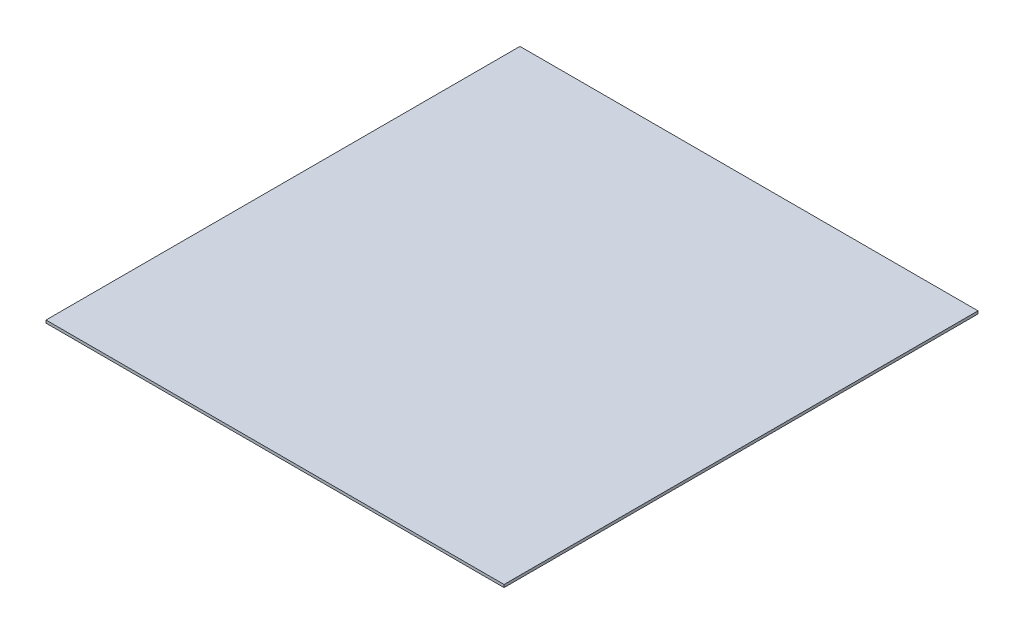
ISO-10303-21;
HEADER;
FILE_DESCRIPTION(('STEP AP214'),'2;1');
FILE_NAME('part.step','',(''),(''),'','','');
FILE_SCHEMA(('AUTOMOTIVE_DESIGN { 1 0 10303 214 1 1 1 1 }'));
ENDSEC;
DATA;
#1=APPLICATION_CONTEXT('core data for automotive mechanical design processes');
#2=APPLICATION_PROTOCOL_DEFINITION('international standard','automotive_design',2000,#1);
#3=PRODUCT_CONTEXT('',#1,'mechanical');
#4=PRODUCT('Part','Part','',(#3));
#5=PRODUCT_RELATED_PRODUCT_CATEGORY('part','',(#4));
#6=PRODUCT_DEFINITION_FORMATION('','',#4);
#7=PRODUCT_DEFINITION_CONTEXT('part definition',#1,'design');
#8=PRODUCT_DEFINITION('design','',#6,#7);
#9=PRODUCT_DEFINITION_SHAPE('','',#8);
#10=(LENGTH_UNIT() NAMED_UNIT(*) SI_UNIT(.MILLI.,.METRE.));
#11=(NAMED_UNIT(*) PLANE_ANGLE_UNIT() SI_UNIT($,.RADIAN.));
#12=(NAMED_UNIT(*) SI_UNIT($,.STERADIAN.) SOLID_ANGLE_UNIT());
#13=UNCERTAINTY_MEASURE_WITH_UNIT(LENGTH_MEASURE(1.E-05),#10,'distance_accuracy_value','');
#14=(GEOMETRIC_REPRESENTATION_CONTEXT(3) GLOBAL_UNCERTAINTY_ASSIGNED_CONTEXT((#13)) GLOBAL_UNIT_ASSIGNED_CONTEXT((#10,
#11,#12)) REPRESENTATION_CONTEXT('',''));
#15=CARTESIAN_POINT('',(0.,0.,0.));
#16=DIRECTION('',(0.,0.,1.));
#17=DIRECTION('',(1.,0.,0.));
#18=AXIS2_PLACEMENT_3D('',#15,#16,#17);
#19=CARTESIAN_POINT('',(0.,9.,0.));
#20=DIRECTION('',(1.,0.,0.));
#21=DIRECTION('',(0.,0.,-1.));
#22=AXIS2_PLACEMENT_3D('',#19,#20,#21);
#23=PLANE('',#22);
#24=DIRECTION('',(0.,0.,1.));
#25=VECTOR('',#24,1.);
#26=CARTESIAN_POINT('',(0.,0.,0.));
#27=LINE('',#26,#25);
#28=CARTESIAN_POINT('',(0.,0.,0.));
#29=VERTEX_POINT('',#28);
#30=CARTESIAN_POINT('',(1.90065183227669E-13,0.,1552.));
#31=VERTEX_POINT('',#30);
#32=EDGE_CURVE('E113',#29,#31,#27,.T.);
#33=ORIENTED_EDGE('',*,*,#32,.T.);
#34=DIRECTION('',(0.,-1.,0.));
#35=VECTOR('',#34,1.);
#36=CARTESIAN_POINT('',(1.90065183227669E-13,9.,1552.));
#37=LINE('',#36,#35);
#38=CARTESIAN_POINT('',(1.90065183227669E-13,9.,1552.));
#39=VERTEX_POINT('',#38);
#40=EDGE_CURVE('E11',#39,#31,#37,.T.);
#41=ORIENTED_EDGE('',*,*,#40,.F.);
#42=DIRECTION('',(0.,0.,1.));
#43=VECTOR('',#42,1.);
#44=CARTESIAN_POINT('',(0.,9.,0.));
#45=LINE('',#44,#43);
#46=CARTESIAN_POINT('',(0.,9.,0.));
#47=VERTEX_POINT('',#46);
#48=EDGE_CURVE('E97',#47,#39,#45,.T.);
#49=ORIENTED_EDGE('',*,*,#48,.F.);
#50=DIRECTION('',(0.,-1.,0.));
#51=VECTOR('',#50,1.);
#52=CARTESIAN_POINT('',(0.,9.,0.));
#53=LINE('',#52,#51);
#54=EDGE_CURVE('E109',#47,#29,#53,.T.);
#55=ORIENTED_EDGE('',*,*,#54,.T.);
#56=EDGE_LOOP('',(#33,#41,#49,#55));
#57=FACE_BOUND('',#56,.T.);
#58=ADVANCED_FACE('F45',(#57),#23,.F.);
#59=CARTESIAN_POINT('',(1.90065183227669E-13,9.,1552.));
#60=DIRECTION('',(0.,0.,-1.));
#61=DIRECTION('',(-1.,0.,0.));
#62=AXIS2_PLACEMENT_3D('',#59,#60,#61);
#63=PLANE('',#62);
#64=DIRECTION('',(1.,0.,0.));
#65=VECTOR('',#64,1.);
#66=CARTESIAN_POINT('',(1.90065183227669E-13,0.,1552.));
#67=LINE('',#66,#65);
#68=CARTESIAN_POINT('',(1500.,0.,1552.));
#69=VERTEX_POINT('',#68);
#70=EDGE_CURVE('E102',#31,#69,#67,.T.);
#71=ORIENTED_EDGE('',*,*,#70,.T.);
#72=DIRECTION('',(0.,-1.,0.));
#73=VECTOR('',#72,1.);
#74=CARTESIAN_POINT('',(1500.,9.,1552.));
#75=LINE('',#74,#73);
#76=CARTESIAN_POINT('',(1500.,9.,1552.));
#77=VERTEX_POINT('',#76);
#78=EDGE_CURVE('E54',#77,#69,#75,.T.);
#79=ORIENTED_EDGE('',*,*,#78,.F.);
#80=DIRECTION('',(1.,0.,0.));
#81=VECTOR('',#80,1.);
#82=CARTESIAN_POINT('',(1.90065183227669E-13,9.,1552.));
#83=LINE('',#82,#81);
#84=EDGE_CURVE('E92',#39,#77,#83,.T.);
#85=ORIENTED_EDGE('',*,*,#84,.F.);
#86=ORIENTED_EDGE('',*,*,#40,.T.);
#87=EDGE_LOOP('',(#71,#79,#85,#86));
#88=FACE_BOUND('',#87,.T.);
#89=ADVANCED_FACE('F101',(#88),#63,.F.);
#90=CARTESIAN_POINT('',(1500.,9.,0.));
#91=DIRECTION('',(-1.,0.,0.));
#92=DIRECTION('',(0.,0.,1.));
#93=AXIS2_PLACEMENT_3D('',#90,#91,#92);
#94=PLANE('',#93);
#95=DIRECTION('',(0.,0.,-1.));
#96=VECTOR('',#95,1.);
#97=CARTESIAN_POINT('',(1500.,0.,0.));
#98=LINE('',#97,#96);
#99=CARTESIAN_POINT('',(1500.,0.,0.));
#100=VERTEX_POINT('',#99);
#101=EDGE_CURVE('E79',#69,#100,#98,.T.);
#102=ORIENTED_EDGE('',*,*,#101,.T.);
#103=DIRECTION('',(0.,-1.,0.));
#104=VECTOR('',#103,1.);
#105=CARTESIAN_POINT('',(1500.,9.,0.));
#106=LINE('',#105,#104);
#107=CARTESIAN_POINT('',(1500.,9.,0.));
#108=VERTEX_POINT('',#107);
#109=EDGE_CURVE('E104',#108,#100,#106,.T.);
#110=ORIENTED_EDGE('',*,*,#109,.F.);
#111=DIRECTION('',(0.,0.,-1.));
#112=VECTOR('',#111,1.);
#113=CARTESIAN_POINT('',(1500.,9.,0.));
#114=LINE('',#113,#112);
#115=EDGE_CURVE('E95',#77,#108,#114,.T.);
#116=ORIENTED_EDGE('',*,*,#115,.F.);
#117=ORIENTED_EDGE('',*,*,#78,.T.);
#118=EDGE_LOOP('',(#102,#110,#116,#117));
#119=FACE_BOUND('',#118,.T.);
#120=ADVANCED_FACE('F105',(#119),#94,.F.);
#121=CARTESIAN_POINT('',(0.,9.,0.));
#122=DIRECTION('',(0.,0.,1.));
#123=DIRECTION('',(1.,0.,0.));
#124=AXIS2_PLACEMENT_3D('',#121,#122,#123);
#125=PLANE('',#124);
#126=DIRECTION('',(-1.,0.,0.));
#127=VECTOR('',#126,1.);
#128=CARTESIAN_POINT('',(0.,0.,0.));
#129=LINE('',#128,#127);
#130=EDGE_CURVE('E85',#100,#29,#129,.T.);
#131=ORIENTED_EDGE('',*,*,#130,.T.);
#132=ORIENTED_EDGE('',*,*,#54,.F.);
#133=DIRECTION('',(-1.,0.,0.));
#134=VECTOR('',#133,1.);
#135=CARTESIAN_POINT('',(0.,9.,0.));
#136=LINE('',#135,#134);
#137=EDGE_CURVE('E62',#108,#47,#136,.T.);
#138=ORIENTED_EDGE('',*,*,#137,.F.);
#139=ORIENTED_EDGE('',*,*,#109,.T.);
#140=EDGE_LOOP('',(#131,#132,#138,#139));
#141=FACE_BOUND('',#140,.T.);
#142=ADVANCED_FACE('F126',(#141),#125,.F.);
#143=CARTESIAN_POINT('',(0.,9.,0.));
#144=DIRECTION('',(0.,1.,0.));
#145=DIRECTION('',(0.,0.,1.));
#146=AXIS2_PLACEMENT_3D('',#143,#144,#145);
#147=PLANE('',#146);
#148=ORIENTED_EDGE('',*,*,#48,.T.);
#149=ORIENTED_EDGE('',*,*,#84,.T.);
#150=ORIENTED_EDGE('',*,*,#115,.T.);
#151=ORIENTED_EDGE('',*,*,#137,.T.);
#152=EDGE_LOOP('',(#148,#149,#150,#151));
#153=FACE_BOUND('',#152,.T.);
#154=ADVANCED_FACE('F93',(#153),#147,.T.);
#155=CARTESIAN_POINT('',(0.,0.,0.));
#156=DIRECTION('',(0.,1.,0.));
#157=DIRECTION('',(0.,0.,1.));
#158=AXIS2_PLACEMENT_3D('',#155,#156,#157);
#159=PLANE('',#158);
#160=ORIENTED_EDGE('',*,*,#32,.F.);
#161=ORIENTED_EDGE('',*,*,#130,.F.);
#162=ORIENTED_EDGE('',*,*,#101,.F.);
#163=ORIENTED_EDGE('',*,*,#70,.F.);
#164=EDGE_LOOP('',(#160,#161,#162,#163));
#165=FACE_BOUND('',#164,.T.);
#166=ADVANCED_FACE('F129',(#165),#159,.F.);
#167=CLOSED_SHELL('',(#58,#89,#120,#142,#154,#166));
#168=MANIFOLD_SOLID_BREP('B2',#167);
#169=ADVANCED_BREP_SHAPE_REPRESENTATION('',(#18,#168),#14);
#170=SHAPE_DEFINITION_REPRESENTATION(#9,#169);
ENDSEC;
END-ISO-10303-21;
